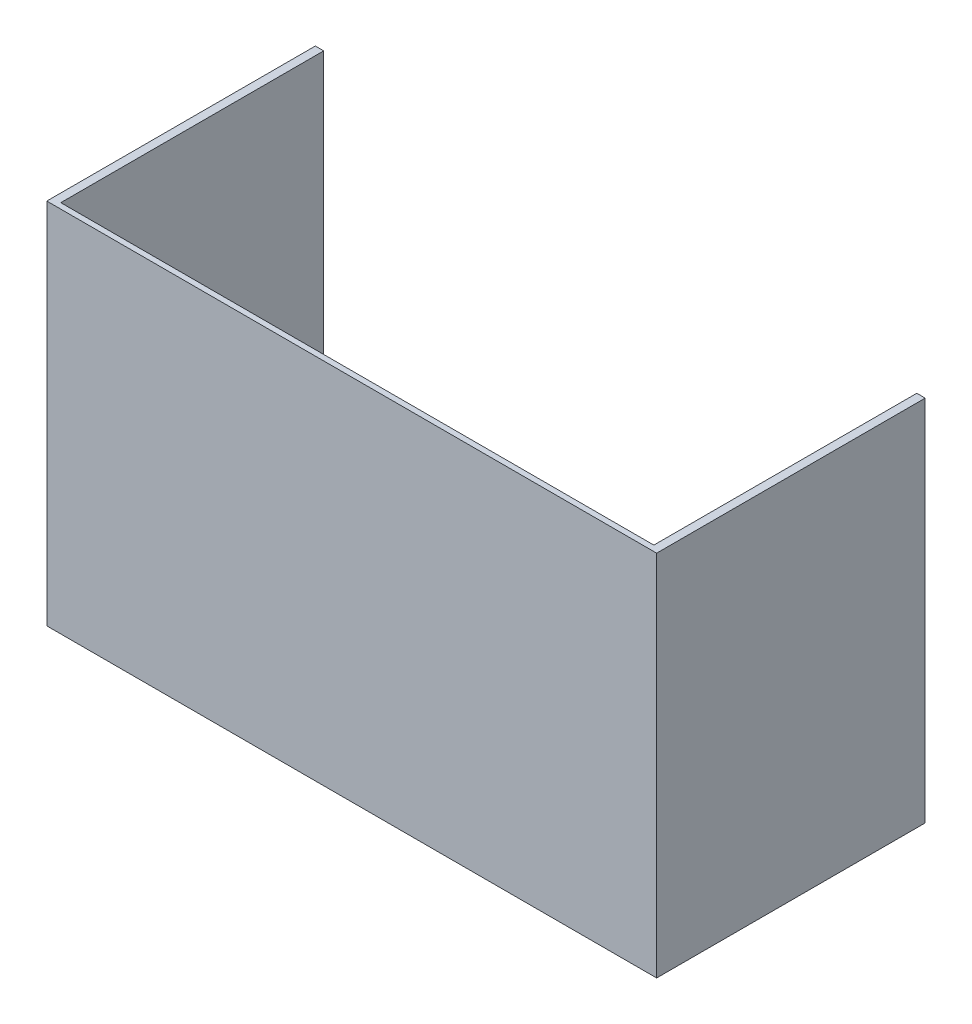
ISO-10303-21;
HEADER;
FILE_DESCRIPTION(('STEP AP214'),'2;1');
FILE_NAME('part.step','',(''),(''),'','','');
FILE_SCHEMA(('AUTOMOTIVE_DESIGN { 1 0 10303 214 1 1 1 1 }'));
ENDSEC;
DATA;
#1=APPLICATION_CONTEXT('core data for automotive mechanical design processes');
#2=APPLICATION_PROTOCOL_DEFINITION('international standard','automotive_design',2000,#1);
#3=PRODUCT_CONTEXT('',#1,'mechanical');
#4=PRODUCT('Part','Part','',(#3));
#5=PRODUCT_RELATED_PRODUCT_CATEGORY('part','',(#4));
#6=PRODUCT_DEFINITION_FORMATION('','',#4);
#7=PRODUCT_DEFINITION_CONTEXT('part definition',#1,'design');
#8=PRODUCT_DEFINITION('design','',#6,#7);
#9=PRODUCT_DEFINITION_SHAPE('','',#8);
#10=(LENGTH_UNIT() NAMED_UNIT(*) SI_UNIT(.MILLI.,.METRE.));
#11=(NAMED_UNIT(*) PLANE_ANGLE_UNIT() SI_UNIT($,.RADIAN.));
#12=(NAMED_UNIT(*) SI_UNIT($,.STERADIAN.) SOLID_ANGLE_UNIT());
#13=UNCERTAINTY_MEASURE_WITH_UNIT(LENGTH_MEASURE(1.E-05),#10,'distance_accuracy_value','');
#14=(GEOMETRIC_REPRESENTATION_CONTEXT(3) GLOBAL_UNCERTAINTY_ASSIGNED_CONTEXT((#13)) GLOBAL_UNIT_ASSIGNED_CONTEXT((#10,
#11,#12)) REPRESENTATION_CONTEXT('',''));
#15=CARTESIAN_POINT('',(0.,0.,0.));
#16=DIRECTION('',(0.,0.,1.));
#17=DIRECTION('',(1.,0.,0.));
#18=AXIS2_PLACEMENT_3D('',#15,#16,#17);
#19=CARTESIAN_POINT('',(0.,0.,0.));
#20=DIRECTION('',(0.,0.,1.));
#21=DIRECTION('',(1.,0.,0.));
#22=AXIS2_PLACEMENT_3D('',#19,#20,#21);
#23=PLANE('',#22);
#24=DIRECTION('',(-1.,0.,0.));
#25=VECTOR('',#24,1.);
#26=CARTESIAN_POINT('',(-346.075,208.788,0.));
#27=LINE('',#26,#25);
#28=CARTESIAN_POINT('',(-336.55,208.788,0.));
#29=VERTEX_POINT('',#28);
#30=CARTESIAN_POINT('',(-346.075,208.788,0.));
#31=VERTEX_POINT('',#30);
#32=EDGE_CURVE('E156',#29,#31,#27,.T.);
#33=ORIENTED_EDGE('',*,*,#32,.F.);
#34=DIRECTION('',(0.,1.,0.));
#35=VECTOR('',#34,1.);
#36=CARTESIAN_POINT('',(-336.55,208.788,0.));
#37=LINE('',#36,#35);
#38=CARTESIAN_POINT('',(-336.55,-208.788,0.));
#39=VERTEX_POINT('',#38);
#40=EDGE_CURVE('E117',#39,#29,#37,.T.);
#41=ORIENTED_EDGE('',*,*,#40,.F.);
#42=DIRECTION('',(1.,0.,0.));
#43=VECTOR('',#42,1.);
#44=CARTESIAN_POINT('',(-346.075,-208.788,0.));
#45=LINE('',#44,#43);
#46=CARTESIAN_POINT('',(-346.075,-208.788,0.));
#47=VERTEX_POINT('',#46);
#48=EDGE_CURVE('E148',#47,#39,#45,.T.);
#49=ORIENTED_EDGE('',*,*,#48,.F.);
#50=DIRECTION('',(0.,-1.,0.));
#51=VECTOR('',#50,1.);
#52=CARTESIAN_POINT('',(-346.075,208.788,0.));
#53=LINE('',#52,#51);
#54=EDGE_CURVE('E159',#31,#47,#53,.T.);
#55=ORIENTED_EDGE('',*,*,#54,.F.);
#56=EDGE_LOOP('',(#33,#41,#49,#55));
#57=FACE_BOUND('',#56,.T.);
#58=ADVANCED_FACE('F38',(#57),#23,.F.);
#59=CARTESIAN_POINT('',(346.075,208.788,304.8));
#60=DIRECTION('',(-1.,0.,0.));
#61=DIRECTION('',(0.,0.,1.));
#62=AXIS2_PLACEMENT_3D('',#59,#60,#61);
#63=PLANE('',#62);
#64=DIRECTION('',(0.,1.,0.));
#65=VECTOR('',#64,1.);
#66=CARTESIAN_POINT('',(346.075,208.788,0.));
#67=LINE('',#66,#65);
#68=CARTESIAN_POINT('',(346.075,-208.788,0.));
#69=VERTEX_POINT('',#68);
#70=CARTESIAN_POINT('',(346.075,208.788,0.));
#71=VERTEX_POINT('',#70);
#72=EDGE_CURVE('E142',#69,#71,#67,.T.);
#73=ORIENTED_EDGE('',*,*,#72,.T.);
#74=DIRECTION('',(0.,0.,-1.));
#75=VECTOR('',#74,1.);
#76=CARTESIAN_POINT('',(346.075,208.788,304.8));
#77=LINE('',#76,#75);
#78=CARTESIAN_POINT('',(346.075,208.788,304.8));
#79=VERTEX_POINT('',#78);
#80=EDGE_CURVE('E11',#79,#71,#77,.T.);
#81=ORIENTED_EDGE('',*,*,#80,.F.);
#82=DIRECTION('',(0.,1.,0.));
#83=VECTOR('',#82,1.);
#84=CARTESIAN_POINT('',(346.075,208.788,304.8));
#85=LINE('',#84,#83);
#86=CARTESIAN_POINT('',(346.075,-208.788,304.8));
#87=VERTEX_POINT('',#86);
#88=EDGE_CURVE('E146',#87,#79,#85,.T.);
#89=ORIENTED_EDGE('',*,*,#88,.F.);
#90=DIRECTION('',(0.,0.,-1.));
#91=VECTOR('',#90,1.);
#92=CARTESIAN_POINT('',(346.075,-208.788,304.8));
#93=LINE('',#92,#91);
#94=EDGE_CURVE('E153',#87,#69,#93,.T.);
#95=ORIENTED_EDGE('',*,*,#94,.T.);
#96=EDGE_LOOP('',(#73,#81,#89,#95));
#97=FACE_BOUND('',#96,.T.);
#98=ADVANCED_FACE('F40',(#97),#63,.F.);
#99=CARTESIAN_POINT('',(-346.075,208.788,304.8));
#100=DIRECTION('',(0.,-1.,0.));
#101=DIRECTION('',(1.,0.,0.));
#102=AXIS2_PLACEMENT_3D('',#99,#100,#101);
#103=PLANE('',#102);
#104=DIRECTION('',(1.,0.,0.));
#105=VECTOR('',#104,1.);
#106=CARTESIAN_POINT('',(336.55,208.788,298.45));
#107=LINE('',#106,#105);
#108=CARTESIAN_POINT('',(-336.55,208.788,298.45));
#109=VERTEX_POINT('',#108);
#110=CARTESIAN_POINT('',(336.55,208.788,298.45));
#111=VERTEX_POINT('',#110);
#112=EDGE_CURVE('E126',#109,#111,#107,.T.);
#113=ORIENTED_EDGE('',*,*,#112,.F.);
#114=DIRECTION('',(0.,0.,-1.));
#115=VECTOR('',#114,1.);
#116=CARTESIAN_POINT('',(-336.55,208.788,298.45));
#117=LINE('',#116,#115);
#118=EDGE_CURVE('E111',#109,#29,#117,.T.);
#119=ORIENTED_EDGE('',*,*,#118,.T.);
#120=ORIENTED_EDGE('',*,*,#32,.T.);
#121=DIRECTION('',(0.,0.,-1.));
#122=VECTOR('',#121,1.);
#123=CARTESIAN_POINT('',(-346.075,208.788,304.8));
#124=LINE('',#123,#122);
#125=CARTESIAN_POINT('',(-346.075,208.788,304.8));
#126=VERTEX_POINT('',#125);
#127=EDGE_CURVE('E46',#126,#31,#124,.T.);
#128=ORIENTED_EDGE('',*,*,#127,.F.);
#129=DIRECTION('',(-1.,0.,0.));
#130=VECTOR('',#129,1.);
#131=CARTESIAN_POINT('',(-346.075,208.788,304.8));
#132=LINE('',#131,#130);
#133=EDGE_CURVE('E90',#79,#126,#132,.T.);
#134=ORIENTED_EDGE('',*,*,#133,.F.);
#135=ORIENTED_EDGE('',*,*,#80,.T.);
#136=CARTESIAN_POINT('',(336.55,208.788,0.));
#137=VERTEX_POINT('',#136);
#138=EDGE_CURVE('E157',#71,#137,#27,.T.);
#139=ORIENTED_EDGE('',*,*,#138,.T.);
#140=DIRECTION('',(0.,0.,-1.));
#141=VECTOR('',#140,1.);
#142=CARTESIAN_POINT('',(336.55,208.788,298.45));
#143=LINE('',#142,#141);
#144=EDGE_CURVE('E53',#111,#137,#143,.T.);
#145=ORIENTED_EDGE('',*,*,#144,.F.);
#146=EDGE_LOOP('',(#113,#119,#120,#128,#134,#135,#139,#145));
#147=FACE_BOUND('',#146,.T.);
#148=ADVANCED_FACE('F131',(#147),#103,.F.);
#149=CARTESIAN_POINT('',(-346.075,208.788,304.8));
#150=DIRECTION('',(1.,0.,0.));
#151=DIRECTION('',(0.,0.,-1.));
#152=AXIS2_PLACEMENT_3D('',#149,#150,#151);
#153=PLANE('',#152);
#154=ORIENTED_EDGE('',*,*,#54,.T.);
#155=DIRECTION('',(0.,0.,-1.));
#156=VECTOR('',#155,1.);
#157=CARTESIAN_POINT('',(-346.075,-208.788,304.8));
#158=LINE('',#157,#156);
#159=CARTESIAN_POINT('',(-346.075,-208.788,304.8));
#160=VERTEX_POINT('',#159);
#161=EDGE_CURVE('E164',#160,#47,#158,.T.);
#162=ORIENTED_EDGE('',*,*,#161,.F.);
#163=DIRECTION('',(0.,-1.,0.));
#164=VECTOR('',#163,1.);
#165=CARTESIAN_POINT('',(-346.075,208.788,304.8));
#166=LINE('',#165,#164);
#167=EDGE_CURVE('E150',#126,#160,#166,.T.);
#168=ORIENTED_EDGE('',*,*,#167,.F.);
#169=ORIENTED_EDGE('',*,*,#127,.T.);
#170=EDGE_LOOP('',(#154,#162,#168,#169));
#171=FACE_BOUND('',#170,.T.);
#172=ADVANCED_FACE('F170',(#171),#153,.F.);
#173=CARTESIAN_POINT('',(-346.075,-208.788,304.8));
#174=DIRECTION('',(0.,1.,0.));
#175=DIRECTION('',(0.,0.,1.));
#176=AXIS2_PLACEMENT_3D('',#173,#174,#175);
#177=PLANE('',#176);
#178=ORIENTED_EDGE('',*,*,#48,.T.);
#179=DIRECTION('',(0.,0.,-1.));
#180=VECTOR('',#179,1.);
#181=CARTESIAN_POINT('',(-336.55,-208.788,298.45));
#182=LINE('',#181,#180);
#183=CARTESIAN_POINT('',(-336.55,-208.788,298.45));
#184=VERTEX_POINT('',#183);
#185=EDGE_CURVE('E140',#184,#39,#182,.T.);
#186=ORIENTED_EDGE('',*,*,#185,.F.);
#187=DIRECTION('',(-1.,0.,0.));
#188=VECTOR('',#187,1.);
#189=CARTESIAN_POINT('',(336.55,-208.788,298.45));
#190=LINE('',#189,#188);
#191=CARTESIAN_POINT('',(336.55,-208.788,298.45));
#192=VERTEX_POINT('',#191);
#193=EDGE_CURVE('E120',#192,#184,#190,.T.);
#194=ORIENTED_EDGE('',*,*,#193,.F.);
#195=DIRECTION('',(0.,0.,-1.));
#196=VECTOR('',#195,1.);
#197=CARTESIAN_POINT('',(336.55,-208.788,298.45));
#198=LINE('',#197,#196);
#199=CARTESIAN_POINT('',(336.55,-208.788,0.));
#200=VERTEX_POINT('',#199);
#201=EDGE_CURVE('E143',#192,#200,#198,.T.);
#202=ORIENTED_EDGE('',*,*,#201,.T.);
#203=EDGE_CURVE('E83',#200,#69,#45,.T.);
#204=ORIENTED_EDGE('',*,*,#203,.T.);
#205=ORIENTED_EDGE('',*,*,#94,.F.);
#206=DIRECTION('',(1.,0.,0.));
#207=VECTOR('',#206,1.);
#208=CARTESIAN_POINT('',(-346.075,-208.788,304.8));
#209=LINE('',#208,#207);
#210=EDGE_CURVE('E62',#160,#87,#209,.T.);
#211=ORIENTED_EDGE('',*,*,#210,.F.);
#212=ORIENTED_EDGE('',*,*,#161,.T.);
#213=EDGE_LOOP('',(#178,#186,#194,#202,#204,#205,#211,#212));
#214=FACE_BOUND('',#213,.T.);
#215=ADVANCED_FACE('F174',(#214),#177,.F.);
#216=CARTESIAN_POINT('',(0.,0.,304.8));
#217=DIRECTION('',(0.,0.,1.));
#218=DIRECTION('',(1.,0.,0.));
#219=AXIS2_PLACEMENT_3D('',#216,#217,#218);
#220=PLANE('',#219);
#221=ORIENTED_EDGE('',*,*,#88,.T.);
#222=ORIENTED_EDGE('',*,*,#133,.T.);
#223=ORIENTED_EDGE('',*,*,#167,.T.);
#224=ORIENTED_EDGE('',*,*,#210,.T.);
#225=EDGE_LOOP('',(#221,#222,#223,#224));
#226=FACE_BOUND('',#225,.T.);
#227=ADVANCED_FACE('F179',(#226),#220,.T.);
#228=ORIENTED_EDGE('',*,*,#203,.F.);
#229=DIRECTION('',(0.,-1.,0.));
#230=VECTOR('',#229,1.);
#231=CARTESIAN_POINT('',(336.55,208.788,0.));
#232=LINE('',#231,#230);
#233=EDGE_CURVE('E129',#137,#200,#232,.T.);
#234=ORIENTED_EDGE('',*,*,#233,.F.);
#235=ORIENTED_EDGE('',*,*,#138,.F.);
#236=ORIENTED_EDGE('',*,*,#72,.F.);
#237=EDGE_LOOP('',(#228,#234,#235,#236));
#238=FACE_BOUND('',#237,.T.);
#239=ADVANCED_FACE('F181',(#238),#23,.F.);
#240=CARTESIAN_POINT('',(-336.55,208.788,298.45));
#241=DIRECTION('',(-1.,0.,0.));
#242=DIRECTION('',(0.,0.,1.));
#243=AXIS2_PLACEMENT_3D('',#240,#241,#242);
#244=PLANE('',#243);
#245=ORIENTED_EDGE('',*,*,#40,.T.);
#246=ORIENTED_EDGE('',*,*,#118,.F.);
#247=DIRECTION('',(0.,1.,0.));
#248=VECTOR('',#247,1.);
#249=CARTESIAN_POINT('',(-336.55,208.788,298.45));
#250=LINE('',#249,#248);
#251=EDGE_CURVE('E114',#184,#109,#250,.T.);
#252=ORIENTED_EDGE('',*,*,#251,.F.);
#253=ORIENTED_EDGE('',*,*,#185,.T.);
#254=EDGE_LOOP('',(#245,#246,#252,#253));
#255=FACE_BOUND('',#254,.T.);
#256=ADVANCED_FACE('F113',(#255),#244,.F.);
#257=CARTESIAN_POINT('',(336.55,208.788,298.45));
#258=DIRECTION('',(1.,0.,0.));
#259=DIRECTION('',(0.,0.,-1.));
#260=AXIS2_PLACEMENT_3D('',#257,#258,#259);
#261=PLANE('',#260);
#262=ORIENTED_EDGE('',*,*,#233,.T.);
#263=ORIENTED_EDGE('',*,*,#201,.F.);
#264=DIRECTION('',(0.,-1.,0.));
#265=VECTOR('',#264,1.);
#266=CARTESIAN_POINT('',(336.55,208.788,298.45));
#267=LINE('',#266,#265);
#268=EDGE_CURVE('E133',#111,#192,#267,.T.);
#269=ORIENTED_EDGE('',*,*,#268,.F.);
#270=ORIENTED_EDGE('',*,*,#144,.T.);
#271=EDGE_LOOP('',(#262,#263,#269,#270));
#272=FACE_BOUND('',#271,.T.);
#273=ADVANCED_FACE('F220',(#272),#261,.F.);
#274=CARTESIAN_POINT('',(0.,0.,298.45));
#275=DIRECTION('',(0.,0.,-1.));
#276=DIRECTION('',(-1.,0.,0.));
#277=AXIS2_PLACEMENT_3D('',#274,#275,#276);
#278=PLANE('',#277);
#279=ORIENTED_EDGE('',*,*,#251,.T.);
#280=ORIENTED_EDGE('',*,*,#112,.T.);
#281=ORIENTED_EDGE('',*,*,#268,.T.);
#282=ORIENTED_EDGE('',*,*,#193,.T.);
#283=EDGE_LOOP('',(#279,#280,#281,#282));
#284=FACE_BOUND('',#283,.T.);
#285=ADVANCED_FACE('F124',(#284),#278,.T.);
#286=CLOSED_SHELL('',(#58,#98,#148,#172,#215,#227,#239,#256,#273,#285));
#287=MANIFOLD_SOLID_BREP('B2',#286);
#288=ADVANCED_BREP_SHAPE_REPRESENTATION('',(#18,#287),#14);
#289=SHAPE_DEFINITION_REPRESENTATION(#9,#288);
ENDSEC;
END-ISO-10303-21;
